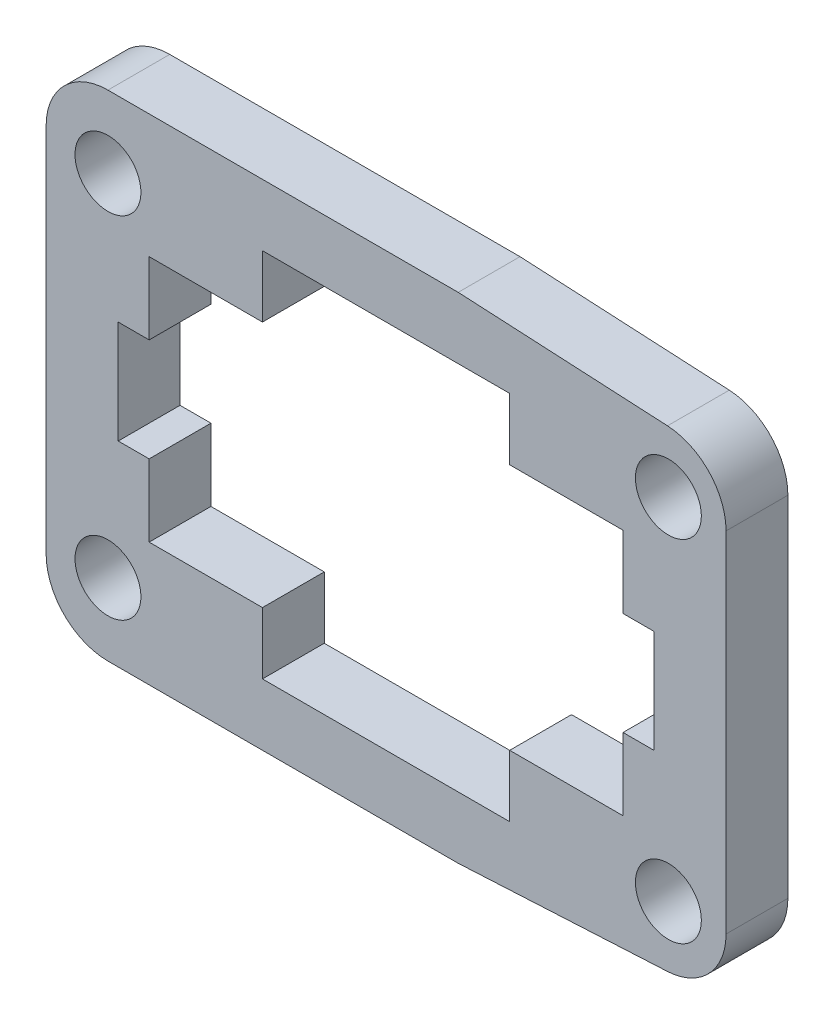
ISO-10303-21;
HEADER;
FILE_DESCRIPTION(('STEP AP214'),'2;1');
FILE_NAME('part.step','',(''),(''),'','','');
FILE_SCHEMA(('AUTOMOTIVE_DESIGN { 1 0 10303 214 1 1 1 1 }'));
ENDSEC;
DATA;
#1=APPLICATION_CONTEXT('core data for automotive mechanical design processes');
#2=APPLICATION_PROTOCOL_DEFINITION('international standard','automotive_design',2000,#1);
#3=PRODUCT_CONTEXT('',#1,'mechanical');
#4=PRODUCT('Part','Part','',(#3));
#5=PRODUCT_RELATED_PRODUCT_CATEGORY('part','',(#4));
#6=PRODUCT_DEFINITION_FORMATION('','',#4);
#7=PRODUCT_DEFINITION_CONTEXT('part definition',#1,'design');
#8=PRODUCT_DEFINITION('design','',#6,#7);
#9=PRODUCT_DEFINITION_SHAPE('','',#8);
#10=(LENGTH_UNIT() NAMED_UNIT(*) SI_UNIT(.MILLI.,.METRE.));
#11=(NAMED_UNIT(*) PLANE_ANGLE_UNIT() SI_UNIT($,.RADIAN.));
#12=(NAMED_UNIT(*) SI_UNIT($,.STERADIAN.) SOLID_ANGLE_UNIT());
#13=UNCERTAINTY_MEASURE_WITH_UNIT(LENGTH_MEASURE(1.E-05),#10,'distance_accuracy_value','');
#14=(GEOMETRIC_REPRESENTATION_CONTEXT(3) GLOBAL_UNCERTAINTY_ASSIGNED_CONTEXT((#13)) GLOBAL_UNIT_ASSIGNED_CONTEXT((#10,
#11,#12)) REPRESENTATION_CONTEXT('',''));
#15=CARTESIAN_POINT('',(0.,0.,0.));
#16=DIRECTION('',(0.,0.,1.));
#17=DIRECTION('',(1.,0.,0.));
#18=AXIS2_PLACEMENT_3D('',#15,#16,#17);
#19=CARTESIAN_POINT('',(24.0010920540107,23.4678047027526,0.));
#20=DIRECTION('',(0.0523034033778794,0.998631240245913,0.));
#21=DIRECTION('',(-0.998631240245913,0.0523034033778794,0.));
#22=AXIS2_PLACEMENT_3D('',#19,#20,#21);
#23=PLANE('',#22);
#24=DIRECTION('',(-0.998631240245913,0.0523034033778794,0.));
#25=VECTOR('',#24,1.);
#26=CARTESIAN_POINT('',(24.0010920540107,23.4678047027526,3.));
#27=LINE('',#26,#25);
#28=CARTESIAN_POINT('',(24.0010920540107,23.4678047027526,3.));
#29=VERTEX_POINT('',#28);
#30=CARTESIAN_POINT('',(13.8436818438771,23.9998,3.));
#31=VERTEX_POINT('',#30);
#32=EDGE_CURVE('E369',#29,#31,#27,.T.);
#33=ORIENTED_EDGE('',*,*,#32,.F.);
#34=DIRECTION('',(0.,0.,1.));
#35=VECTOR('',#34,1.);
#36=CARTESIAN_POINT('',(24.0010920540107,23.4678047027526,0.));
#37=LINE('',#36,#35);
#38=CARTESIAN_POINT('',(24.0010920540107,23.4678047027526,0.));
#39=VERTEX_POINT('',#38);
#40=EDGE_CURVE('E11',#39,#29,#37,.T.);
#41=ORIENTED_EDGE('',*,*,#40,.F.);
#42=DIRECTION('',(-0.998631240245913,0.0523034033778794,0.));
#43=VECTOR('',#42,1.);
#44=CARTESIAN_POINT('',(24.0010920540107,23.4678047027526,0.));
#45=LINE('',#44,#43);
#46=CARTESIAN_POINT('',(13.8436818438771,23.9998,0.));
#47=VERTEX_POINT('',#46);
#48=EDGE_CURVE('E405',#39,#47,#45,.T.);
#49=ORIENTED_EDGE('',*,*,#48,.T.);
#50=DIRECTION('',(0.,0.,1.));
#51=VECTOR('',#50,1.);
#52=CARTESIAN_POINT('',(13.8436818438771,23.9998,0.));
#53=LINE('',#52,#51);
#54=EDGE_CURVE('E42',#47,#31,#53,.T.);
#55=ORIENTED_EDGE('',*,*,#54,.T.);
#56=EDGE_LOOP('',(#33,#41,#49,#55));
#57=FACE_BOUND('',#56,.T.);
#58=ADVANCED_FACE('F39',(#57),#23,.T.);
#59=CARTESIAN_POINT('',(23.844181843877,20.4719109820149,0.));
#60=DIRECTION('',(0.,0.,1.));
#61=DIRECTION('',(1.,0.,0.));
#62=AXIS2_PLACEMENT_3D('',#59,#60,#61);
#63=CYLINDRICAL_SURFACE('',#62,2.99999999999996);
#64=CARTESIAN_POINT('',(23.844181843877,20.4719109820149,3.));
#65=DIRECTION('',(0.,0.,1.));
#66=DIRECTION('',(1.,0.,0.));
#67=AXIS2_PLACEMENT_3D('',#64,#65,#66);
#68=CIRCLE('',#67,2.99999999999996);
#69=CARTESIAN_POINT('',(26.844181843877,20.4719109820149,3.));
#70=VERTEX_POINT('',#69);
#71=EDGE_CURVE('E409',#70,#29,#68,.T.);
#72=ORIENTED_EDGE('',*,*,#71,.F.);
#73=DIRECTION('',(0.,0.,1.));
#74=VECTOR('',#73,1.);
#75=CARTESIAN_POINT('',(26.844181843877,20.4719109820149,0.));
#76=LINE('',#75,#74);
#77=CARTESIAN_POINT('',(26.844181843877,20.4719109820149,0.));
#78=VERTEX_POINT('',#77);
#79=EDGE_CURVE('E47',#78,#70,#76,.T.);
#80=ORIENTED_EDGE('',*,*,#79,.F.);
#81=CARTESIAN_POINT('',(23.844181843877,20.4719109820149,0.));
#82=DIRECTION('',(0.,0.,1.));
#83=DIRECTION('',(1.,0.,0.));
#84=AXIS2_PLACEMENT_3D('',#81,#82,#83);
#85=CIRCLE('',#84,2.99999999999996);
#86=EDGE_CURVE('E433',#78,#39,#85,.T.);
#87=ORIENTED_EDGE('',*,*,#86,.T.);
#88=ORIENTED_EDGE('',*,*,#40,.T.);
#89=EDGE_LOOP('',(#72,#80,#87,#88));
#90=FACE_BOUND('',#89,.T.);
#91=ADVANCED_FACE('F490',(#90),#63,.T.);
#92=CARTESIAN_POINT('',(26.844181843877,3.52888902362418,0.));
#93=DIRECTION('',(1.,0.,0.));
#94=DIRECTION('',(0.,1.,0.));
#95=AXIS2_PLACEMENT_3D('',#92,#93,#94);
#96=PLANE('',#95);
#97=DIRECTION('',(0.,1.,0.));
#98=VECTOR('',#97,1.);
#99=CARTESIAN_POINT('',(26.844181843877,3.52888902362418,3.));
#100=LINE('',#99,#98);
#101=CARTESIAN_POINT('',(26.844181843877,3.52888902362418,3.));
#102=VERTEX_POINT('',#101);
#103=EDGE_CURVE('E459',#102,#70,#100,.T.);
#104=ORIENTED_EDGE('',*,*,#103,.F.);
#105=DIRECTION('',(0.,0.,1.));
#106=VECTOR('',#105,1.);
#107=CARTESIAN_POINT('',(26.844181843877,3.52888902362418,0.));
#108=LINE('',#107,#106);
#109=CARTESIAN_POINT('',(26.844181843877,3.52888902362418,0.));
#110=VERTEX_POINT('',#109);
#111=EDGE_CURVE('E465',#110,#102,#108,.T.);
#112=ORIENTED_EDGE('',*,*,#111,.F.);
#113=DIRECTION('',(0.,1.,0.));
#114=VECTOR('',#113,1.);
#115=CARTESIAN_POINT('',(26.844181843877,3.52888902362418,0.));
#116=LINE('',#115,#114);
#117=EDGE_CURVE('E430',#110,#78,#116,.T.);
#118=ORIENTED_EDGE('',*,*,#117,.T.);
#119=ORIENTED_EDGE('',*,*,#79,.T.);
#120=EDGE_LOOP('',(#104,#112,#118,#119));
#121=FACE_BOUND('',#120,.T.);
#122=ADVANCED_FACE('F517',(#121),#96,.T.);
#123=CARTESIAN_POINT('',(23.844181843877,3.52888902362418,0.));
#124=DIRECTION('',(0.,0.,1.));
#125=DIRECTION('',(1.,0.,0.));
#126=AXIS2_PLACEMENT_3D('',#123,#124,#125);
#127=CYLINDRICAL_SURFACE('',#126,3.);
#128=CARTESIAN_POINT('',(23.844181843877,3.52888902362418,3.));
#129=DIRECTION('',(0.,0.,1.));
#130=DIRECTION('',(1.,0.,0.));
#131=AXIS2_PLACEMENT_3D('',#128,#129,#130);
#132=CIRCLE('',#131,3.);
#133=CARTESIAN_POINT('',(24.0013861888821,0.533010722706151,3.));
#134=VERTEX_POINT('',#133);
#135=EDGE_CURVE('E456',#134,#102,#132,.T.);
#136=ORIENTED_EDGE('',*,*,#135,.F.);
#137=DIRECTION('',(0.,0.,1.));
#138=VECTOR('',#137,1.);
#139=CARTESIAN_POINT('',(24.0013861888821,0.533010722706151,0.));
#140=LINE('',#139,#138);
#141=CARTESIAN_POINT('',(24.0013861888821,0.533010722706151,0.));
#142=VERTEX_POINT('',#141);
#143=EDGE_CURVE('E467',#142,#134,#140,.T.);
#144=ORIENTED_EDGE('',*,*,#143,.F.);
#145=CARTESIAN_POINT('',(23.844181843877,3.52888902362418,0.));
#146=DIRECTION('',(0.,0.,1.));
#147=DIRECTION('',(1.,0.,0.));
#148=AXIS2_PLACEMENT_3D('',#145,#146,#147);
#149=CIRCLE('',#148,3.);
#150=EDGE_CURVE('E427',#142,#110,#149,.T.);
#151=ORIENTED_EDGE('',*,*,#150,.T.);
#152=ORIENTED_EDGE('',*,*,#111,.T.);
#153=EDGE_LOOP('',(#136,#144,#151,#152));
#154=FACE_BOUND('',#153,.T.);
#155=ADVANCED_FACE('F515',(#154),#127,.T.);
#156=CARTESIAN_POINT('',(13.8436818438771,0.,0.));
#157=DIRECTION('',(0.0524014483350339,-0.998626100306011,0.));
#158=DIRECTION('',(0.998626100306011,0.0524014483350339,0.));
#159=AXIS2_PLACEMENT_3D('',#156,#157,#158);
#160=PLANE('',#159);
#161=DIRECTION('',(0.998626100306011,0.0524014483350339,0.));
#162=VECTOR('',#161,1.);
#163=CARTESIAN_POINT('',(13.8436818438771,0.,3.));
#164=LINE('',#163,#162);
#165=CARTESIAN_POINT('',(13.8436818438771,0.,3.));
#166=VERTEX_POINT('',#165);
#167=EDGE_CURVE('E453',#166,#134,#164,.T.);
#168=ORIENTED_EDGE('',*,*,#167,.F.);
#169=DIRECTION('',(0.,0.,1.));
#170=VECTOR('',#169,1.);
#171=CARTESIAN_POINT('',(13.8436818438771,0.,0.));
#172=LINE('',#171,#170);
#173=CARTESIAN_POINT('',(13.8436818438771,0.,0.));
#174=VERTEX_POINT('',#173);
#175=EDGE_CURVE('E469',#174,#166,#172,.T.);
#176=ORIENTED_EDGE('',*,*,#175,.F.);
#177=DIRECTION('',(0.998626100306011,0.0524014483350339,0.));
#178=VECTOR('',#177,1.);
#179=CARTESIAN_POINT('',(13.8436818438771,0.,0.));
#180=LINE('',#179,#178);
#181=EDGE_CURVE('E424',#174,#142,#180,.T.);
#182=ORIENTED_EDGE('',*,*,#181,.T.);
#183=ORIENTED_EDGE('',*,*,#143,.T.);
#184=EDGE_LOOP('',(#168,#176,#182,#183));
#185=FACE_BOUND('',#184,.T.);
#186=ADVANCED_FACE('F511',(#185),#160,.T.);
#187=CARTESIAN_POINT('',(-3.15711815612296,0.,0.));
#188=DIRECTION('',(0.,-1.,0.));
#189=DIRECTION('',(0.,0.,-1.));
#190=AXIS2_PLACEMENT_3D('',#187,#188,#189);
#191=PLANE('',#190);
#192=DIRECTION('',(1.,0.,0.));
#193=VECTOR('',#192,1.);
#194=CARTESIAN_POINT('',(-3.15711815612296,0.,3.));
#195=LINE('',#194,#193);
#196=CARTESIAN_POINT('',(-3.15711815612296,0.,3.));
#197=VERTEX_POINT('',#196);
#198=EDGE_CURVE('E450',#197,#166,#195,.T.);
#199=ORIENTED_EDGE('',*,*,#198,.F.);
#200=DIRECTION('',(0.,0.,1.));
#201=VECTOR('',#200,1.);
#202=CARTESIAN_POINT('',(-3.15711815612296,0.,0.));
#203=LINE('',#202,#201);
#204=CARTESIAN_POINT('',(-3.15711815612296,0.,0.));
#205=VERTEX_POINT('',#204);
#206=EDGE_CURVE('E471',#205,#197,#203,.T.);
#207=ORIENTED_EDGE('',*,*,#206,.F.);
#208=DIRECTION('',(1.,0.,0.));
#209=VECTOR('',#208,1.);
#210=CARTESIAN_POINT('',(-3.15711815612296,0.,0.));
#211=LINE('',#210,#209);
#212=EDGE_CURVE('E421',#205,#174,#211,.T.);
#213=ORIENTED_EDGE('',*,*,#212,.T.);
#214=ORIENTED_EDGE('',*,*,#175,.T.);
#215=EDGE_LOOP('',(#199,#207,#213,#214));
#216=FACE_BOUND('',#215,.T.);
#217=ADVANCED_FACE('F507',(#216),#191,.T.);
#218=CARTESIAN_POINT('',(-3.15711815612296,3.,0.));
#219=DIRECTION('',(0.,0.,1.));
#220=DIRECTION('',(1.,0.,0.));
#221=AXIS2_PLACEMENT_3D('',#218,#219,#220);
#222=CYLINDRICAL_SURFACE('',#221,3.);
#223=CARTESIAN_POINT('',(-3.15711815612296,3.,3.));
#224=DIRECTION('',(0.,0.,1.));
#225=DIRECTION('',(1.,0.,0.));
#226=AXIS2_PLACEMENT_3D('',#223,#224,#225);
#227=CIRCLE('',#226,3.);
#228=CARTESIAN_POINT('',(-6.15711815612296,3.,3.));
#229=VERTEX_POINT('',#228);
#230=EDGE_CURVE('E447',#229,#197,#227,.T.);
#231=ORIENTED_EDGE('',*,*,#230,.F.);
#232=DIRECTION('',(0.,0.,1.));
#233=VECTOR('',#232,1.);
#234=CARTESIAN_POINT('',(-6.15711815612296,3.,0.));
#235=LINE('',#234,#233);
#236=CARTESIAN_POINT('',(-6.15711815612296,3.,0.));
#237=VERTEX_POINT('',#236);
#238=EDGE_CURVE('E473',#237,#229,#235,.T.);
#239=ORIENTED_EDGE('',*,*,#238,.F.);
#240=CARTESIAN_POINT('',(-3.15711815612296,3.,0.));
#241=DIRECTION('',(0.,0.,1.));
#242=DIRECTION('',(1.,0.,0.));
#243=AXIS2_PLACEMENT_3D('',#240,#241,#242);
#244=CIRCLE('',#243,3.);
#245=EDGE_CURVE('E418',#237,#205,#244,.T.);
#246=ORIENTED_EDGE('',*,*,#245,.T.);
#247=ORIENTED_EDGE('',*,*,#206,.T.);
#248=EDGE_LOOP('',(#231,#239,#246,#247));
#249=FACE_BOUND('',#248,.T.);
#250=ADVANCED_FACE('F503',(#249),#222,.T.);
#251=CARTESIAN_POINT('',(-6.15711815612297,20.9998,0.));
#252=DIRECTION('',(-1.,0.,0.));
#253=DIRECTION('',(0.,-1.,0.));
#254=AXIS2_PLACEMENT_3D('',#251,#252,#253);
#255=PLANE('',#254);
#256=DIRECTION('',(0.,-1.,0.));
#257=VECTOR('',#256,1.);
#258=CARTESIAN_POINT('',(-6.15711815612297,20.9998,3.));
#259=LINE('',#258,#257);
#260=CARTESIAN_POINT('',(-6.15711815612296,20.9998,3.));
#261=VERTEX_POINT('',#260);
#262=EDGE_CURVE('E444',#261,#229,#259,.T.);
#263=ORIENTED_EDGE('',*,*,#262,.F.);
#264=DIRECTION('',(0.,0.,1.));
#265=VECTOR('',#264,1.);
#266=CARTESIAN_POINT('',(-6.15711815612296,20.9998,0.));
#267=LINE('',#266,#265);
#268=CARTESIAN_POINT('',(-6.15711815612296,20.9998,0.));
#269=VERTEX_POINT('',#268);
#270=EDGE_CURVE('E475',#269,#261,#267,.T.);
#271=ORIENTED_EDGE('',*,*,#270,.F.);
#272=DIRECTION('',(0.,-1.,0.));
#273=VECTOR('',#272,1.);
#274=CARTESIAN_POINT('',(-6.15711815612297,20.9998,0.));
#275=LINE('',#274,#273);
#276=EDGE_CURVE('E415',#269,#237,#275,.T.);
#277=ORIENTED_EDGE('',*,*,#276,.T.);
#278=ORIENTED_EDGE('',*,*,#238,.T.);
#279=EDGE_LOOP('',(#263,#271,#277,#278));
#280=FACE_BOUND('',#279,.T.);
#281=ADVANCED_FACE('F501',(#280),#255,.T.);
#282=CARTESIAN_POINT('',(-3.15711815612296,20.9998,0.));
#283=DIRECTION('',(0.,0.,1.));
#284=DIRECTION('',(1.,0.,0.));
#285=AXIS2_PLACEMENT_3D('',#282,#283,#284);
#286=CYLINDRICAL_SURFACE('',#285,3.);
#287=CARTESIAN_POINT('',(-3.15711815612296,20.9998,3.));
#288=DIRECTION('',(0.,0.,1.));
#289=DIRECTION('',(1.,0.,0.));
#290=AXIS2_PLACEMENT_3D('',#287,#288,#289);
#291=CIRCLE('',#290,3.);
#292=CARTESIAN_POINT('',(-3.15711815612296,23.9998,3.));
#293=VERTEX_POINT('',#292);
#294=EDGE_CURVE('E441',#293,#261,#291,.T.);
#295=ORIENTED_EDGE('',*,*,#294,.F.);
#296=DIRECTION('',(0.,0.,1.));
#297=VECTOR('',#296,1.);
#298=CARTESIAN_POINT('',(-3.15711815612296,23.9998,0.));
#299=LINE('',#298,#297);
#300=CARTESIAN_POINT('',(-3.15711815612296,23.9998,0.));
#301=VERTEX_POINT('',#300);
#302=EDGE_CURVE('E476',#301,#293,#299,.T.);
#303=ORIENTED_EDGE('',*,*,#302,.F.);
#304=CARTESIAN_POINT('',(-3.15711815612296,20.9998,0.));
#305=DIRECTION('',(0.,0.,1.));
#306=DIRECTION('',(1.,0.,0.));
#307=AXIS2_PLACEMENT_3D('',#304,#305,#306);
#308=CIRCLE('',#307,3.);
#309=EDGE_CURVE('E412',#301,#269,#308,.T.);
#310=ORIENTED_EDGE('',*,*,#309,.T.);
#311=ORIENTED_EDGE('',*,*,#270,.T.);
#312=EDGE_LOOP('',(#295,#303,#310,#311));
#313=FACE_BOUND('',#312,.T.);
#314=ADVANCED_FACE('F497',(#313),#286,.T.);
#315=CARTESIAN_POINT('',(13.8436818438771,23.9998,0.));
#316=DIRECTION('',(0.,1.,0.));
#317=DIRECTION('',(0.,0.,1.));
#318=AXIS2_PLACEMENT_3D('',#315,#316,#317);
#319=PLANE('',#318);
#320=DIRECTION('',(-1.,0.,0.));
#321=VECTOR('',#320,1.);
#322=CARTESIAN_POINT('',(13.8436818438771,23.9998,3.));
#323=LINE('',#322,#321);
#324=EDGE_CURVE('E438',#31,#293,#323,.T.);
#325=ORIENTED_EDGE('',*,*,#324,.F.);
#326=ORIENTED_EDGE('',*,*,#54,.F.);
#327=DIRECTION('',(-1.,0.,0.));
#328=VECTOR('',#327,1.);
#329=CARTESIAN_POINT('',(13.8436818438771,23.9998,0.));
#330=LINE('',#329,#328);
#331=EDGE_CURVE('E408',#47,#301,#330,.T.);
#332=ORIENTED_EDGE('',*,*,#331,.T.);
#333=ORIENTED_EDGE('',*,*,#302,.T.);
#334=EDGE_LOOP('',(#325,#326,#332,#333));
#335=FACE_BOUND('',#334,.T.);
#336=ADVANCED_FACE('F484',(#335),#319,.T.);
#337=CARTESIAN_POINT('',(-3.15711815612296,20.9998,0.));
#338=DIRECTION('',(0.,0.,1.));
#339=DIRECTION('',(1.,0.,0.));
#340=AXIS2_PLACEMENT_3D('',#337,#338,#339);
#341=PLANE('',#340);
#342=CARTESIAN_POINT('',(-3.15601815612294,3.50114834928544,0.));
#343=DIRECTION('',(0.,0.,1.));
#344=DIRECTION('',(1.,0.,0.));
#345=AXIS2_PLACEMENT_3D('',#342,#343,#344);
#346=CIRCLE('',#345,1.6);
#347=CARTESIAN_POINT('',(-1.55601815612294,3.50114834928544,0.));
#348=VERTEX_POINT('',#347);
#349=EDGE_CURVE('E924',#348,#348,#346,.T.);
#350=ORIENTED_EDGE('',*,*,#349,.T.);
#351=EDGE_LOOP('',(#350));
#352=FACE_BOUND('',#351,.T.);
#353=CARTESIAN_POINT('',(24.044031843877,3.50114834928544,0.));
#354=DIRECTION('',(0.,0.,1.));
#355=DIRECTION('',(1.,0.,0.));
#356=AXIS2_PLACEMENT_3D('',#353,#354,#355);
#357=CIRCLE('',#356,1.6);
#358=CARTESIAN_POINT('',(25.644031843877,3.50114834928544,0.));
#359=VERTEX_POINT('',#358);
#360=EDGE_CURVE('E945',#359,#359,#357,.T.);
#361=ORIENTED_EDGE('',*,*,#360,.T.);
#362=EDGE_LOOP('',(#361));
#363=FACE_BOUND('',#362,.T.);
#364=CARTESIAN_POINT('',(24.044031843877,20.4983516507146,0.));
#365=DIRECTION('',(0.,0.,1.));
#366=DIRECTION('',(1.,0.,0.));
#367=AXIS2_PLACEMENT_3D('',#364,#365,#366);
#368=CIRCLE('',#367,1.6);
#369=CARTESIAN_POINT('',(25.644031843877,20.4983516507146,0.));
#370=VERTEX_POINT('',#369);
#371=EDGE_CURVE('E936',#370,#370,#368,.T.);
#372=ORIENTED_EDGE('',*,*,#371,.T.);
#373=EDGE_LOOP('',(#372));
#374=FACE_BOUND('',#373,.T.);
#375=CARTESIAN_POINT('',(-3.15601815612294,20.4983516507146,0.));
#376=DIRECTION('',(0.,0.,1.));
#377=DIRECTION('',(1.,0.,0.));
#378=AXIS2_PLACEMENT_3D('',#375,#376,#377);
#379=CIRCLE('',#378,1.6);
#380=CARTESIAN_POINT('',(-1.55601815612294,20.4983516507146,0.));
#381=VERTEX_POINT('',#380);
#382=EDGE_CURVE('E315',#381,#381,#379,.T.);
#383=ORIENTED_EDGE('',*,*,#382,.T.);
#384=EDGE_LOOP('',(#383));
#385=FACE_BOUND('',#384,.T.);
#386=DIRECTION('',(-1.,0.,0.));
#387=VECTOR('',#386,1.);
#388=CARTESIAN_POINT('',(21.843181843877,14.4995,0.));
#389=LINE('',#388,#387);
#390=CARTESIAN_POINT('',(23.343481843877,14.4995,0.));
#391=VERTEX_POINT('',#390);
#392=CARTESIAN_POINT('',(21.843181843877,14.4995,0.));
#393=VERTEX_POINT('',#392);
#394=EDGE_CURVE('E244',#391,#393,#389,.T.);
#395=ORIENTED_EDGE('',*,*,#394,.T.);
#396=DIRECTION('',(0.,1.,0.));
#397=VECTOR('',#396,1.);
#398=CARTESIAN_POINT('',(21.843181843877,17.9998,0.));
#399=LINE('',#398,#397);
#400=CARTESIAN_POINT('',(21.843181843877,17.9998,0.));
#401=VERTEX_POINT('',#400);
#402=EDGE_CURVE('E238',#393,#401,#399,.T.);
#403=ORIENTED_EDGE('',*,*,#402,.T.);
#404=DIRECTION('',(-1.,0.,0.));
#405=VECTOR('',#404,1.);
#406=CARTESIAN_POINT('',(16.3433818438771,17.9998,0.));
#407=LINE('',#406,#405);
#408=CARTESIAN_POINT('',(16.3433818438771,17.9998,0.));
#409=VERTEX_POINT('',#408);
#410=EDGE_CURVE('E247',#401,#409,#407,.T.);
#411=ORIENTED_EDGE('',*,*,#410,.T.);
#412=DIRECTION('',(0.,1.,0.));
#413=VECTOR('',#412,1.);
#414=CARTESIAN_POINT('',(16.3433818438771,20.9998,0.));
#415=LINE('',#414,#413);
#416=CARTESIAN_POINT('',(16.3433818438771,20.9998,0.));
#417=VERTEX_POINT('',#416);
#418=EDGE_CURVE('E55',#409,#417,#415,.T.);
#419=ORIENTED_EDGE('',*,*,#418,.T.);
#420=DIRECTION('',(-1.,0.,0.));
#421=VECTOR('',#420,1.);
#422=CARTESIAN_POINT('',(4.34338184387702,20.9998,0.));
#423=LINE('',#422,#421);
#424=CARTESIAN_POINT('',(4.34338184387702,20.9998,0.));
#425=VERTEX_POINT('',#424);
#426=EDGE_CURVE('E265',#417,#425,#423,.T.);
#427=ORIENTED_EDGE('',*,*,#426,.T.);
#428=DIRECTION('',(0.,-1.,0.));
#429=VECTOR('',#428,1.);
#430=CARTESIAN_POINT('',(4.34338184387702,17.9998,0.));
#431=LINE('',#430,#429);
#432=CARTESIAN_POINT('',(4.34338184387702,17.9998,0.));
#433=VERTEX_POINT('',#432);
#434=EDGE_CURVE('E268',#425,#433,#431,.T.);
#435=ORIENTED_EDGE('',*,*,#434,.T.);
#436=DIRECTION('',(-1.,0.,0.));
#437=VECTOR('',#436,1.);
#438=CARTESIAN_POINT('',(-1.15651815612298,17.9998,0.));
#439=LINE('',#438,#437);
#440=CARTESIAN_POINT('',(-1.15651815612298,17.9998,0.));
#441=VERTEX_POINT('',#440);
#442=EDGE_CURVE('E271',#433,#441,#439,.T.);
#443=ORIENTED_EDGE('',*,*,#442,.T.);
#444=DIRECTION('',(0.,-1.,0.));
#445=VECTOR('',#444,1.);
#446=CARTESIAN_POINT('',(-1.15651815612297,14.4995,0.));
#447=LINE('',#446,#445);
#448=CARTESIAN_POINT('',(-1.15651815612297,14.4995,0.));
#449=VERTEX_POINT('',#448);
#450=EDGE_CURVE('E274',#441,#449,#447,.T.);
#451=ORIENTED_EDGE('',*,*,#450,.T.);
#452=DIRECTION('',(-1.,0.,0.));
#453=VECTOR('',#452,1.);
#454=CARTESIAN_POINT('',(-2.65681815612294,14.4995,0.));
#455=LINE('',#454,#453);
#456=CARTESIAN_POINT('',(-2.65681815612294,14.4995,0.));
#457=VERTEX_POINT('',#456);
#458=EDGE_CURVE('E277',#449,#457,#455,.T.);
#459=ORIENTED_EDGE('',*,*,#458,.T.);
#460=DIRECTION('',(0.,-1.,0.));
#461=VECTOR('',#460,1.);
#462=CARTESIAN_POINT('',(-2.65681815612294,9.5,0.));
#463=LINE('',#462,#461);
#464=CARTESIAN_POINT('',(-2.65681815612294,9.5,0.));
#465=VERTEX_POINT('',#464);
#466=EDGE_CURVE('E280',#457,#465,#463,.T.);
#467=ORIENTED_EDGE('',*,*,#466,.T.);
#468=DIRECTION('',(1.,0.,0.));
#469=VECTOR('',#468,1.);
#470=CARTESIAN_POINT('',(-1.15651815612297,9.5,0.));
#471=LINE('',#470,#469);
#472=CARTESIAN_POINT('',(-1.15651815612297,9.5,0.));
#473=VERTEX_POINT('',#472);
#474=EDGE_CURVE('E283',#465,#473,#471,.T.);
#475=ORIENTED_EDGE('',*,*,#474,.T.);
#476=DIRECTION('',(0.,-1.,0.));
#477=VECTOR('',#476,1.);
#478=CARTESIAN_POINT('',(-1.15651815612298,6.,0.));
#479=LINE('',#478,#477);
#480=CARTESIAN_POINT('',(-1.15651815612298,6.,0.));
#481=VERTEX_POINT('',#480);
#482=EDGE_CURVE('E286',#473,#481,#479,.T.);
#483=ORIENTED_EDGE('',*,*,#482,.T.);
#484=DIRECTION('',(1.,0.,0.));
#485=VECTOR('',#484,1.);
#486=CARTESIAN_POINT('',(4.34338184387701,6.,0.));
#487=LINE('',#486,#485);
#488=CARTESIAN_POINT('',(4.34338184387701,6.,0.));
#489=VERTEX_POINT('',#488);
#490=EDGE_CURVE('E289',#481,#489,#487,.T.);
#491=ORIENTED_EDGE('',*,*,#490,.T.);
#492=DIRECTION('',(0.,-1.,0.));
#493=VECTOR('',#492,1.);
#494=CARTESIAN_POINT('',(4.34338184387701,3.,0.));
#495=LINE('',#494,#493);
#496=CARTESIAN_POINT('',(4.34338184387701,3.,0.));
#497=VERTEX_POINT('',#496);
#498=EDGE_CURVE('E292',#489,#497,#495,.T.);
#499=ORIENTED_EDGE('',*,*,#498,.T.);
#500=DIRECTION('',(1.,0.,0.));
#501=VECTOR('',#500,1.);
#502=CARTESIAN_POINT('',(16.3433818438771,3.,0.));
#503=LINE('',#502,#501);
#504=CARTESIAN_POINT('',(16.3433818438771,3.,0.));
#505=VERTEX_POINT('',#504);
#506=EDGE_CURVE('E295',#497,#505,#503,.T.);
#507=ORIENTED_EDGE('',*,*,#506,.T.);
#508=DIRECTION('',(0.,1.,0.));
#509=VECTOR('',#508,1.);
#510=CARTESIAN_POINT('',(16.3433818438771,6.,0.));
#511=LINE('',#510,#509);
#512=CARTESIAN_POINT('',(16.3433818438771,6.,0.));
#513=VERTEX_POINT('',#512);
#514=EDGE_CURVE('E298',#505,#513,#511,.T.);
#515=ORIENTED_EDGE('',*,*,#514,.T.);
#516=DIRECTION('',(1.,0.,0.));
#517=VECTOR('',#516,1.);
#518=CARTESIAN_POINT('',(21.843181843877,6.,0.));
#519=LINE('',#518,#517);
#520=CARTESIAN_POINT('',(21.843181843877,6.,0.));
#521=VERTEX_POINT('',#520);
#522=EDGE_CURVE('E301',#513,#521,#519,.T.);
#523=ORIENTED_EDGE('',*,*,#522,.T.);
#524=DIRECTION('',(0.,1.,0.));
#525=VECTOR('',#524,1.);
#526=CARTESIAN_POINT('',(21.843181843877,9.5,0.));
#527=LINE('',#526,#525);
#528=CARTESIAN_POINT('',(21.843181843877,9.5,0.));
#529=VERTEX_POINT('',#528);
#530=EDGE_CURVE('E304',#521,#529,#527,.T.);
#531=ORIENTED_EDGE('',*,*,#530,.T.);
#532=DIRECTION('',(1.,0.,0.));
#533=VECTOR('',#532,1.);
#534=CARTESIAN_POINT('',(23.343481843877,9.5,0.));
#535=LINE('',#534,#533);
#536=CARTESIAN_POINT('',(23.343481843877,9.5,0.));
#537=VERTEX_POINT('',#536);
#538=EDGE_CURVE('E307',#529,#537,#535,.T.);
#539=ORIENTED_EDGE('',*,*,#538,.T.);
#540=DIRECTION('',(0.,1.,0.));
#541=VECTOR('',#540,1.);
#542=CARTESIAN_POINT('',(23.343481843877,14.4995,0.));
#543=LINE('',#542,#541);
#544=EDGE_CURVE('E310',#537,#391,#543,.T.);
#545=ORIENTED_EDGE('',*,*,#544,.T.);
#546=EDGE_LOOP('',(#395,#403,#411,#419,#427,#435,#443,#451,#459,#467,#475,#483,#491,#499,#507,
#515,#523,#531,#539,#545));
#547=FACE_BOUND('',#546,.T.);
#548=ORIENTED_EDGE('',*,*,#48,.F.);
#549=ORIENTED_EDGE('',*,*,#86,.F.);
#550=ORIENTED_EDGE('',*,*,#117,.F.);
#551=ORIENTED_EDGE('',*,*,#150,.F.);
#552=ORIENTED_EDGE('',*,*,#181,.F.);
#553=ORIENTED_EDGE('',*,*,#212,.F.);
#554=ORIENTED_EDGE('',*,*,#245,.F.);
#555=ORIENTED_EDGE('',*,*,#276,.F.);
#556=ORIENTED_EDGE('',*,*,#309,.F.);
#557=ORIENTED_EDGE('',*,*,#331,.F.);
#558=EDGE_LOOP('',(#548,#549,#550,#551,#552,#553,#554,#555,#556,#557));
#559=FACE_BOUND('',#558,.T.);
#560=ADVANCED_FACE('F251',(#352,#363,#374,#385,#547,#559),#341,.F.);
#561=CARTESIAN_POINT('',(-3.15711815612296,20.9998,3.));
#562=DIRECTION('',(0.,0.,1.));
#563=DIRECTION('',(1.,0.,0.));
#564=AXIS2_PLACEMENT_3D('',#561,#562,#563);
#565=PLANE('',#564);
#566=CARTESIAN_POINT('',(-3.15601815612294,3.50114834928544,3.));
#567=DIRECTION('',(0.,0.,1.));
#568=DIRECTION('',(1.,0.,0.));
#569=AXIS2_PLACEMENT_3D('',#566,#567,#568);
#570=CIRCLE('',#569,1.6);
#571=CARTESIAN_POINT('',(-1.55601815612294,3.50114834928544,3.));
#572=VERTEX_POINT('',#571);
#573=EDGE_CURVE('E927',#572,#572,#570,.T.);
#574=ORIENTED_EDGE('',*,*,#573,.F.);
#575=EDGE_LOOP('',(#574));
#576=FACE_BOUND('',#575,.T.);
#577=CARTESIAN_POINT('',(24.044031843877,3.50114834928544,3.));
#578=DIRECTION('',(0.,0.,1.));
#579=DIRECTION('',(1.,0.,0.));
#580=AXIS2_PLACEMENT_3D('',#577,#578,#579);
#581=CIRCLE('',#580,1.6);
#582=CARTESIAN_POINT('',(25.644031843877,3.50114834928544,3.));
#583=VERTEX_POINT('',#582);
#584=EDGE_CURVE('E929',#583,#583,#581,.T.);
#585=ORIENTED_EDGE('',*,*,#584,.F.);
#586=EDGE_LOOP('',(#585));
#587=FACE_BOUND('',#586,.T.);
#588=CARTESIAN_POINT('',(24.044031843877,20.4983516507146,3.));
#589=DIRECTION('',(0.,0.,1.));
#590=DIRECTION('',(1.,0.,0.));
#591=AXIS2_PLACEMENT_3D('',#588,#589,#590);
#592=CIRCLE('',#591,1.6);
#593=CARTESIAN_POINT('',(25.644031843877,20.4983516507146,3.));
#594=VERTEX_POINT('',#593);
#595=EDGE_CURVE('E940',#594,#594,#592,.T.);
#596=ORIENTED_EDGE('',*,*,#595,.F.);
#597=EDGE_LOOP('',(#596));
#598=FACE_BOUND('',#597,.T.);
#599=CARTESIAN_POINT('',(-3.15601815612294,20.4983516507146,3.));
#600=DIRECTION('',(0.,0.,1.));
#601=DIRECTION('',(1.,0.,0.));
#602=AXIS2_PLACEMENT_3D('',#599,#600,#601);
#603=CIRCLE('',#602,1.6);
#604=CARTESIAN_POINT('',(-1.55601815612294,20.4983516507146,3.));
#605=VERTEX_POINT('',#604);
#606=EDGE_CURVE('E261',#605,#605,#603,.T.);
#607=ORIENTED_EDGE('',*,*,#606,.F.);
#608=EDGE_LOOP('',(#607));
#609=FACE_BOUND('',#608,.T.);
#610=DIRECTION('',(0.,1.,0.));
#611=VECTOR('',#610,1.);
#612=CARTESIAN_POINT('',(21.843181843877,17.9998,3.));
#613=LINE('',#612,#611);
#614=CARTESIAN_POINT('',(21.843181843877,14.4995,3.));
#615=VERTEX_POINT('',#614);
#616=CARTESIAN_POINT('',(21.843181843877,17.9998,3.));
#617=VERTEX_POINT('',#616);
#618=EDGE_CURVE('E63',#615,#617,#613,.T.);
#619=ORIENTED_EDGE('',*,*,#618,.F.);
#620=DIRECTION('',(-1.,0.,0.));
#621=VECTOR('',#620,1.);
#622=CARTESIAN_POINT('',(21.843181843877,14.4995,3.));
#623=LINE('',#622,#621);
#624=CARTESIAN_POINT('',(23.343481843877,14.4995,3.));
#625=VERTEX_POINT('',#624);
#626=EDGE_CURVE('E255',#625,#615,#623,.T.);
#627=ORIENTED_EDGE('',*,*,#626,.F.);
#628=DIRECTION('',(0.,1.,0.));
#629=VECTOR('',#628,1.);
#630=CARTESIAN_POINT('',(23.343481843877,14.4995,3.));
#631=LINE('',#630,#629);
#632=CARTESIAN_POINT('',(23.343481843877,9.5,3.));
#633=VERTEX_POINT('',#632);
#634=EDGE_CURVE('E258',#633,#625,#631,.T.);
#635=ORIENTED_EDGE('',*,*,#634,.F.);
#636=DIRECTION('',(1.,0.,0.));
#637=VECTOR('',#636,1.);
#638=CARTESIAN_POINT('',(23.343481843877,9.5,3.));
#639=LINE('',#638,#637);
#640=CARTESIAN_POINT('',(21.843181843877,9.5,3.));
#641=VERTEX_POINT('',#640);
#642=EDGE_CURVE('E362',#641,#633,#639,.T.);
#643=ORIENTED_EDGE('',*,*,#642,.F.);
#644=DIRECTION('',(0.,1.,0.));
#645=VECTOR('',#644,1.);
#646=CARTESIAN_POINT('',(21.843181843877,9.5,3.));
#647=LINE('',#646,#645);
#648=CARTESIAN_POINT('',(21.843181843877,6.,3.));
#649=VERTEX_POINT('',#648);
#650=EDGE_CURVE('E359',#649,#641,#647,.T.);
#651=ORIENTED_EDGE('',*,*,#650,.F.);
#652=DIRECTION('',(1.,0.,0.));
#653=VECTOR('',#652,1.);
#654=CARTESIAN_POINT('',(21.843181843877,6.,3.));
#655=LINE('',#654,#653);
#656=CARTESIAN_POINT('',(16.3433818438771,6.,3.));
#657=VERTEX_POINT('',#656);
#658=EDGE_CURVE('E356',#657,#649,#655,.T.);
#659=ORIENTED_EDGE('',*,*,#658,.F.);
#660=DIRECTION('',(0.,1.,0.));
#661=VECTOR('',#660,1.);
#662=CARTESIAN_POINT('',(16.3433818438771,6.,3.));
#663=LINE('',#662,#661);
#664=CARTESIAN_POINT('',(16.3433818438771,3.,3.));
#665=VERTEX_POINT('',#664);
#666=EDGE_CURVE('E353',#665,#657,#663,.T.);
#667=ORIENTED_EDGE('',*,*,#666,.F.);
#668=DIRECTION('',(1.,0.,0.));
#669=VECTOR('',#668,1.);
#670=CARTESIAN_POINT('',(16.3433818438771,3.,3.));
#671=LINE('',#670,#669);
#672=CARTESIAN_POINT('',(4.34338184387701,3.,3.));
#673=VERTEX_POINT('',#672);
#674=EDGE_CURVE('E350',#673,#665,#671,.T.);
#675=ORIENTED_EDGE('',*,*,#674,.F.);
#676=DIRECTION('',(0.,-1.,0.));
#677=VECTOR('',#676,1.);
#678=CARTESIAN_POINT('',(4.34338184387701,3.,3.));
#679=LINE('',#678,#677);
#680=CARTESIAN_POINT('',(4.34338184387701,6.,3.));
#681=VERTEX_POINT('',#680);
#682=EDGE_CURVE('E347',#681,#673,#679,.T.);
#683=ORIENTED_EDGE('',*,*,#682,.F.);
#684=DIRECTION('',(1.,0.,0.));
#685=VECTOR('',#684,1.);
#686=CARTESIAN_POINT('',(4.34338184387701,6.,3.));
#687=LINE('',#686,#685);
#688=CARTESIAN_POINT('',(-1.15651815612298,6.,3.));
#689=VERTEX_POINT('',#688);
#690=EDGE_CURVE('E344',#689,#681,#687,.T.);
#691=ORIENTED_EDGE('',*,*,#690,.F.);
#692=DIRECTION('',(0.,-1.,0.));
#693=VECTOR('',#692,1.);
#694=CARTESIAN_POINT('',(-1.15651815612298,6.,3.));
#695=LINE('',#694,#693);
#696=CARTESIAN_POINT('',(-1.15651815612297,9.5,3.));
#697=VERTEX_POINT('',#696);
#698=EDGE_CURVE('E341',#697,#689,#695,.T.);
#699=ORIENTED_EDGE('',*,*,#698,.F.);
#700=DIRECTION('',(1.,0.,0.));
#701=VECTOR('',#700,1.);
#702=CARTESIAN_POINT('',(-1.15651815612297,9.5,3.));
#703=LINE('',#702,#701);
#704=CARTESIAN_POINT('',(-2.65681815612294,9.5,3.));
#705=VERTEX_POINT('',#704);
#706=EDGE_CURVE('E338',#705,#697,#703,.T.);
#707=ORIENTED_EDGE('',*,*,#706,.F.);
#708=DIRECTION('',(0.,-1.,0.));
#709=VECTOR('',#708,1.);
#710=CARTESIAN_POINT('',(-2.65681815612294,9.5,3.));
#711=LINE('',#710,#709);
#712=CARTESIAN_POINT('',(-2.65681815612294,14.4995,3.));
#713=VERTEX_POINT('',#712);
#714=EDGE_CURVE('E335',#713,#705,#711,.T.);
#715=ORIENTED_EDGE('',*,*,#714,.F.);
#716=DIRECTION('',(-1.,0.,0.));
#717=VECTOR('',#716,1.);
#718=CARTESIAN_POINT('',(-2.65681815612294,14.4995,3.));
#719=LINE('',#718,#717);
#720=CARTESIAN_POINT('',(-1.15651815612297,14.4995,3.));
#721=VERTEX_POINT('',#720);
#722=EDGE_CURVE('E332',#721,#713,#719,.T.);
#723=ORIENTED_EDGE('',*,*,#722,.F.);
#724=DIRECTION('',(0.,-1.,0.));
#725=VECTOR('',#724,1.);
#726=CARTESIAN_POINT('',(-1.15651815612297,14.4995,3.));
#727=LINE('',#726,#725);
#728=CARTESIAN_POINT('',(-1.15651815612298,17.9998,3.));
#729=VERTEX_POINT('',#728);
#730=EDGE_CURVE('E329',#729,#721,#727,.T.);
#731=ORIENTED_EDGE('',*,*,#730,.F.);
#732=DIRECTION('',(-1.,0.,0.));
#733=VECTOR('',#732,1.);
#734=CARTESIAN_POINT('',(-1.15651815612298,17.9998,3.));
#735=LINE('',#734,#733);
#736=CARTESIAN_POINT('',(4.34338184387702,17.9998,3.));
#737=VERTEX_POINT('',#736);
#738=EDGE_CURVE('E326',#737,#729,#735,.T.);
#739=ORIENTED_EDGE('',*,*,#738,.F.);
#740=DIRECTION('',(0.,-1.,0.));
#741=VECTOR('',#740,1.);
#742=CARTESIAN_POINT('',(4.34338184387702,17.9998,3.));
#743=LINE('',#742,#741);
#744=CARTESIAN_POINT('',(4.34338184387702,20.9998,3.));
#745=VERTEX_POINT('',#744);
#746=EDGE_CURVE('E323',#745,#737,#743,.T.);
#747=ORIENTED_EDGE('',*,*,#746,.F.);
#748=DIRECTION('',(-1.,0.,0.));
#749=VECTOR('',#748,1.);
#750=CARTESIAN_POINT('',(4.34338184387702,20.9998,3.));
#751=LINE('',#750,#749);
#752=CARTESIAN_POINT('',(16.3433818438771,20.9998,3.));
#753=VERTEX_POINT('',#752);
#754=EDGE_CURVE('E320',#753,#745,#751,.T.);
#755=ORIENTED_EDGE('',*,*,#754,.F.);
#756=DIRECTION('',(0.,1.,0.));
#757=VECTOR('',#756,1.);
#758=CARTESIAN_POINT('',(16.3433818438771,20.9998,3.));
#759=LINE('',#758,#757);
#760=CARTESIAN_POINT('',(16.3433818438771,17.9998,3.));
#761=VERTEX_POINT('',#760);
#762=EDGE_CURVE('E317',#761,#753,#759,.T.);
#763=ORIENTED_EDGE('',*,*,#762,.F.);
#764=DIRECTION('',(-1.,0.,0.));
#765=VECTOR('',#764,1.);
#766=CARTESIAN_POINT('',(16.3433818438771,17.9998,3.));
#767=LINE('',#766,#765);
#768=EDGE_CURVE('E314',#617,#761,#767,.T.);
#769=ORIENTED_EDGE('',*,*,#768,.F.);
#770=EDGE_LOOP('',(#619,#627,#635,#643,#651,#659,#667,#675,#683,#691,#699,#707,#715,#723,#731,
#739,#747,#755,#763,#769));
#771=FACE_BOUND('',#770,.T.);
#772=ORIENTED_EDGE('',*,*,#32,.T.);
#773=ORIENTED_EDGE('',*,*,#324,.T.);
#774=ORIENTED_EDGE('',*,*,#294,.T.);
#775=ORIENTED_EDGE('',*,*,#262,.T.);
#776=ORIENTED_EDGE('',*,*,#230,.T.);
#777=ORIENTED_EDGE('',*,*,#198,.T.);
#778=ORIENTED_EDGE('',*,*,#167,.T.);
#779=ORIENTED_EDGE('',*,*,#135,.T.);
#780=ORIENTED_EDGE('',*,*,#103,.T.);
#781=ORIENTED_EDGE('',*,*,#71,.T.);
#782=EDGE_LOOP('',(#772,#773,#774,#775,#776,#777,#778,#779,#780,#781));
#783=FACE_BOUND('',#782,.T.);
#784=ADVANCED_FACE('F486',(#576,#587,#598,#609,#771,#783),#565,.T.);
#785=CARTESIAN_POINT('',(21.843181843877,17.9998,0.));
#786=DIRECTION('',(1.,0.,0.));
#787=DIRECTION('',(0.,0.,-1.));
#788=AXIS2_PLACEMENT_3D('',#785,#786,#787);
#789=PLANE('',#788);
#790=ORIENTED_EDGE('',*,*,#618,.T.);
#791=DIRECTION('',(0.,0.,1.));
#792=VECTOR('',#791,1.);
#793=CARTESIAN_POINT('',(21.843181843877,17.9998,0.));
#794=LINE('',#793,#792);
#795=EDGE_CURVE('E234',#401,#617,#794,.T.);
#796=ORIENTED_EDGE('',*,*,#795,.F.);
#797=ORIENTED_EDGE('',*,*,#402,.F.);
#798=DIRECTION('',(0.,0.,1.));
#799=VECTOR('',#798,1.);
#800=CARTESIAN_POINT('',(21.843181843877,14.4995,0.));
#801=LINE('',#800,#799);
#802=EDGE_CURVE('E367',#393,#615,#801,.T.);
#803=ORIENTED_EDGE('',*,*,#802,.T.);
#804=EDGE_LOOP('',(#790,#796,#797,#803));
#805=FACE_BOUND('',#804,.T.);
#806=ADVANCED_FACE('F236',(#805),#789,.F.);
#807=CARTESIAN_POINT('',(21.843181843877,14.4995,0.));
#808=DIRECTION('',(0.,1.,0.));
#809=DIRECTION('',(0.,0.,1.));
#810=AXIS2_PLACEMENT_3D('',#807,#808,#809);
#811=PLANE('',#810);
#812=ORIENTED_EDGE('',*,*,#626,.T.);
#813=ORIENTED_EDGE('',*,*,#802,.F.);
#814=ORIENTED_EDGE('',*,*,#394,.F.);
#815=DIRECTION('',(0.,0.,1.));
#816=VECTOR('',#815,1.);
#817=CARTESIAN_POINT('',(23.343481843877,14.4995,0.));
#818=LINE('',#817,#816);
#819=EDGE_CURVE('E370',#391,#625,#818,.T.);
#820=ORIENTED_EDGE('',*,*,#819,.T.);
#821=EDGE_LOOP('',(#812,#813,#814,#820));
#822=FACE_BOUND('',#821,.T.);
#823=ADVANCED_FACE('F610',(#822),#811,.F.);
#824=CARTESIAN_POINT('',(23.343481843877,14.4995,0.));
#825=DIRECTION('',(1.,0.,0.));
#826=DIRECTION('',(0.,0.,-1.));
#827=AXIS2_PLACEMENT_3D('',#824,#825,#826);
#828=PLANE('',#827);
#829=ORIENTED_EDGE('',*,*,#634,.T.);
#830=ORIENTED_EDGE('',*,*,#819,.F.);
#831=ORIENTED_EDGE('',*,*,#544,.F.);
#832=DIRECTION('',(0.,0.,1.));
#833=VECTOR('',#832,1.);
#834=CARTESIAN_POINT('',(23.343481843877,9.5,0.));
#835=LINE('',#834,#833);
#836=EDGE_CURVE('E372',#537,#633,#835,.T.);
#837=ORIENTED_EDGE('',*,*,#836,.T.);
#838=EDGE_LOOP('',(#829,#830,#831,#837));
#839=FACE_BOUND('',#838,.T.);
#840=ADVANCED_FACE('F622',(#839),#828,.F.);
#841=CARTESIAN_POINT('',(23.343481843877,9.5,0.));
#842=DIRECTION('',(0.,-1.,0.));
#843=DIRECTION('',(0.,0.,-1.));
#844=AXIS2_PLACEMENT_3D('',#841,#842,#843);
#845=PLANE('',#844);
#846=ORIENTED_EDGE('',*,*,#642,.T.);
#847=ORIENTED_EDGE('',*,*,#836,.F.);
#848=ORIENTED_EDGE('',*,*,#538,.F.);
#849=DIRECTION('',(0.,0.,1.));
#850=VECTOR('',#849,1.);
#851=CARTESIAN_POINT('',(21.843181843877,9.5,0.));
#852=LINE('',#851,#850);
#853=EDGE_CURVE('E374',#529,#641,#852,.T.);
#854=ORIENTED_EDGE('',*,*,#853,.T.);
#855=EDGE_LOOP('',(#846,#847,#848,#854));
#856=FACE_BOUND('',#855,.T.);
#857=ADVANCED_FACE('F633',(#856),#845,.F.);
#858=CARTESIAN_POINT('',(21.843181843877,9.5,0.));
#859=DIRECTION('',(1.,0.,0.));
#860=DIRECTION('',(0.,0.,-1.));
#861=AXIS2_PLACEMENT_3D('',#858,#859,#860);
#862=PLANE('',#861);
#863=ORIENTED_EDGE('',*,*,#650,.T.);
#864=ORIENTED_EDGE('',*,*,#853,.F.);
#865=ORIENTED_EDGE('',*,*,#530,.F.);
#866=DIRECTION('',(0.,0.,1.));
#867=VECTOR('',#866,1.);
#868=CARTESIAN_POINT('',(21.843181843877,6.,0.));
#869=LINE('',#868,#867);
#870=EDGE_CURVE('E376',#521,#649,#869,.T.);
#871=ORIENTED_EDGE('',*,*,#870,.T.);
#872=EDGE_LOOP('',(#863,#864,#865,#871));
#873=FACE_BOUND('',#872,.T.);
#874=ADVANCED_FACE('F644',(#873),#862,.F.);
#875=CARTESIAN_POINT('',(21.843181843877,6.,0.));
#876=DIRECTION('',(0.,-1.,0.));
#877=DIRECTION('',(0.,0.,-1.));
#878=AXIS2_PLACEMENT_3D('',#875,#876,#877);
#879=PLANE('',#878);
#880=ORIENTED_EDGE('',*,*,#658,.T.);
#881=ORIENTED_EDGE('',*,*,#870,.F.);
#882=ORIENTED_EDGE('',*,*,#522,.F.);
#883=DIRECTION('',(0.,0.,1.));
#884=VECTOR('',#883,1.);
#885=CARTESIAN_POINT('',(16.3433818438771,6.,0.));
#886=LINE('',#885,#884);
#887=EDGE_CURVE('E378',#513,#657,#886,.T.);
#888=ORIENTED_EDGE('',*,*,#887,.T.);
#889=EDGE_LOOP('',(#880,#881,#882,#888));
#890=FACE_BOUND('',#889,.T.);
#891=ADVANCED_FACE('F655',(#890),#879,.F.);
#892=CARTESIAN_POINT('',(16.3433818438771,6.,0.));
#893=DIRECTION('',(1.,0.,0.));
#894=DIRECTION('',(0.,0.,-1.));
#895=AXIS2_PLACEMENT_3D('',#892,#893,#894);
#896=PLANE('',#895);
#897=ORIENTED_EDGE('',*,*,#666,.T.);
#898=ORIENTED_EDGE('',*,*,#887,.F.);
#899=ORIENTED_EDGE('',*,*,#514,.F.);
#900=DIRECTION('',(0.,0.,1.));
#901=VECTOR('',#900,1.);
#902=CARTESIAN_POINT('',(16.3433818438771,3.,0.));
#903=LINE('',#902,#901);
#904=EDGE_CURVE('E380',#505,#665,#903,.T.);
#905=ORIENTED_EDGE('',*,*,#904,.T.);
#906=EDGE_LOOP('',(#897,#898,#899,#905));
#907=FACE_BOUND('',#906,.T.);
#908=ADVANCED_FACE('F666',(#907),#896,.F.);
#909=CARTESIAN_POINT('',(16.3433818438771,3.,0.));
#910=DIRECTION('',(0.,-1.,0.));
#911=DIRECTION('',(0.,0.,-1.));
#912=AXIS2_PLACEMENT_3D('',#909,#910,#911);
#913=PLANE('',#912);
#914=ORIENTED_EDGE('',*,*,#674,.T.);
#915=ORIENTED_EDGE('',*,*,#904,.F.);
#916=ORIENTED_EDGE('',*,*,#506,.F.);
#917=DIRECTION('',(0.,0.,1.));
#918=VECTOR('',#917,1.);
#919=CARTESIAN_POINT('',(4.34338184387701,3.,0.));
#920=LINE('',#919,#918);
#921=EDGE_CURVE('E382',#497,#673,#920,.T.);
#922=ORIENTED_EDGE('',*,*,#921,.T.);
#923=EDGE_LOOP('',(#914,#915,#916,#922));
#924=FACE_BOUND('',#923,.T.);
#925=ADVANCED_FACE('F677',(#924),#913,.F.);
#926=CARTESIAN_POINT('',(4.34338184387701,3.,0.));
#927=DIRECTION('',(-1.,0.,0.));
#928=DIRECTION('',(0.,0.,1.));
#929=AXIS2_PLACEMENT_3D('',#926,#927,#928);
#930=PLANE('',#929);
#931=ORIENTED_EDGE('',*,*,#682,.T.);
#932=ORIENTED_EDGE('',*,*,#921,.F.);
#933=ORIENTED_EDGE('',*,*,#498,.F.);
#934=DIRECTION('',(0.,0.,1.));
#935=VECTOR('',#934,1.);
#936=CARTESIAN_POINT('',(4.34338184387701,6.,0.));
#937=LINE('',#936,#935);
#938=EDGE_CURVE('E384',#489,#681,#937,.T.);
#939=ORIENTED_EDGE('',*,*,#938,.T.);
#940=EDGE_LOOP('',(#931,#932,#933,#939));
#941=FACE_BOUND('',#940,.T.);
#942=ADVANCED_FACE('F688',(#941),#930,.F.);
#943=CARTESIAN_POINT('',(4.34338184387701,6.,0.));
#944=DIRECTION('',(0.,-1.,0.));
#945=DIRECTION('',(0.,0.,-1.));
#946=AXIS2_PLACEMENT_3D('',#943,#944,#945);
#947=PLANE('',#946);
#948=ORIENTED_EDGE('',*,*,#690,.T.);
#949=ORIENTED_EDGE('',*,*,#938,.F.);
#950=ORIENTED_EDGE('',*,*,#490,.F.);
#951=DIRECTION('',(0.,0.,1.));
#952=VECTOR('',#951,1.);
#953=CARTESIAN_POINT('',(-1.15651815612298,6.,0.));
#954=LINE('',#953,#952);
#955=EDGE_CURVE('E386',#481,#689,#954,.T.);
#956=ORIENTED_EDGE('',*,*,#955,.T.);
#957=EDGE_LOOP('',(#948,#949,#950,#956));
#958=FACE_BOUND('',#957,.T.);
#959=ADVANCED_FACE('F699',(#958),#947,.F.);
#960=CARTESIAN_POINT('',(-1.15651815612298,6.,0.));
#961=DIRECTION('',(-1.,0.,0.));
#962=DIRECTION('',(0.,-1.,0.));
#963=AXIS2_PLACEMENT_3D('',#960,#961,#962);
#964=PLANE('',#963);
#965=ORIENTED_EDGE('',*,*,#698,.T.);
#966=ORIENTED_EDGE('',*,*,#955,.F.);
#967=ORIENTED_EDGE('',*,*,#482,.F.);
#968=DIRECTION('',(0.,0.,1.));
#969=VECTOR('',#968,1.);
#970=CARTESIAN_POINT('',(-1.15651815612297,9.5,0.));
#971=LINE('',#970,#969);
#972=EDGE_CURVE('E388',#473,#697,#971,.T.);
#973=ORIENTED_EDGE('',*,*,#972,.T.);
#974=EDGE_LOOP('',(#965,#966,#967,#973));
#975=FACE_BOUND('',#974,.T.);
#976=ADVANCED_FACE('F710',(#975),#964,.F.);
#977=CARTESIAN_POINT('',(-1.15651815612297,9.5,0.));
#978=DIRECTION('',(0.,-1.,0.));
#979=DIRECTION('',(0.,0.,-1.));
#980=AXIS2_PLACEMENT_3D('',#977,#978,#979);
#981=PLANE('',#980);
#982=ORIENTED_EDGE('',*,*,#706,.T.);
#983=ORIENTED_EDGE('',*,*,#972,.F.);
#984=ORIENTED_EDGE('',*,*,#474,.F.);
#985=DIRECTION('',(0.,0.,1.));
#986=VECTOR('',#985,1.);
#987=CARTESIAN_POINT('',(-2.65681815612294,9.5,0.));
#988=LINE('',#987,#986);
#989=EDGE_CURVE('E390',#465,#705,#988,.T.);
#990=ORIENTED_EDGE('',*,*,#989,.T.);
#991=EDGE_LOOP('',(#982,#983,#984,#990));
#992=FACE_BOUND('',#991,.T.);
#993=ADVANCED_FACE('F721',(#992),#981,.F.);
#994=CARTESIAN_POINT('',(-2.65681815612294,9.5,0.));
#995=DIRECTION('',(-1.,0.,0.));
#996=DIRECTION('',(0.,0.,1.));
#997=AXIS2_PLACEMENT_3D('',#994,#995,#996);
#998=PLANE('',#997);
#999=ORIENTED_EDGE('',*,*,#714,.T.);
#1000=ORIENTED_EDGE('',*,*,#989,.F.);
#1001=ORIENTED_EDGE('',*,*,#466,.F.);
#1002=DIRECTION('',(0.,0.,1.));
#1003=VECTOR('',#1002,1.);
#1004=CARTESIAN_POINT('',(-2.65681815612294,14.4995,0.));
#1005=LINE('',#1004,#1003);
#1006=EDGE_CURVE('E392',#457,#713,#1005,.T.);
#1007=ORIENTED_EDGE('',*,*,#1006,.T.);
#1008=EDGE_LOOP('',(#999,#1000,#1001,#1007));
#1009=FACE_BOUND('',#1008,.T.);
#1010=ADVANCED_FACE('F732',(#1009),#998,.F.);
#1011=CARTESIAN_POINT('',(-2.65681815612294,14.4995,0.));
#1012=DIRECTION('',(0.,1.,0.));
#1013=DIRECTION('',(0.,0.,1.));
#1014=AXIS2_PLACEMENT_3D('',#1011,#1012,#1013);
#1015=PLANE('',#1014);
#1016=ORIENTED_EDGE('',*,*,#722,.T.);
#1017=ORIENTED_EDGE('',*,*,#1006,.F.);
#1018=ORIENTED_EDGE('',*,*,#458,.F.);
#1019=DIRECTION('',(0.,0.,1.));
#1020=VECTOR('',#1019,1.);
#1021=CARTESIAN_POINT('',(-1.15651815612297,14.4995,0.));
#1022=LINE('',#1021,#1020);
#1023=EDGE_CURVE('E394',#449,#721,#1022,.T.);
#1024=ORIENTED_EDGE('',*,*,#1023,.T.);
#1025=EDGE_LOOP('',(#1016,#1017,#1018,#1024));
#1026=FACE_BOUND('',#1025,.T.);
#1027=ADVANCED_FACE('F743',(#1026),#1015,.F.);
#1028=CARTESIAN_POINT('',(-1.15651815612297,14.4995,0.));
#1029=DIRECTION('',(-1.,0.,0.));
#1030=DIRECTION('',(0.,-1.,0.));
#1031=AXIS2_PLACEMENT_3D('',#1028,#1029,#1030);
#1032=PLANE('',#1031);
#1033=ORIENTED_EDGE('',*,*,#730,.T.);
#1034=ORIENTED_EDGE('',*,*,#1023,.F.);
#1035=ORIENTED_EDGE('',*,*,#450,.F.);
#1036=DIRECTION('',(0.,0.,1.));
#1037=VECTOR('',#1036,1.);
#1038=CARTESIAN_POINT('',(-1.15651815612298,17.9998,0.));
#1039=LINE('',#1038,#1037);
#1040=EDGE_CURVE('E396',#441,#729,#1039,.T.);
#1041=ORIENTED_EDGE('',*,*,#1040,.T.);
#1042=EDGE_LOOP('',(#1033,#1034,#1035,#1041));
#1043=FACE_BOUND('',#1042,.T.);
#1044=ADVANCED_FACE('F754',(#1043),#1032,.F.);
#1045=CARTESIAN_POINT('',(-1.15651815612298,17.9998,0.));
#1046=DIRECTION('',(0.,1.,0.));
#1047=DIRECTION('',(0.,0.,1.));
#1048=AXIS2_PLACEMENT_3D('',#1045,#1046,#1047);
#1049=PLANE('',#1048);
#1050=ORIENTED_EDGE('',*,*,#738,.T.);
#1051=ORIENTED_EDGE('',*,*,#1040,.F.);
#1052=ORIENTED_EDGE('',*,*,#442,.F.);
#1053=DIRECTION('',(0.,0.,1.));
#1054=VECTOR('',#1053,1.);
#1055=CARTESIAN_POINT('',(4.34338184387702,17.9998,0.));
#1056=LINE('',#1055,#1054);
#1057=EDGE_CURVE('E398',#433,#737,#1056,.T.);
#1058=ORIENTED_EDGE('',*,*,#1057,.T.);
#1059=EDGE_LOOP('',(#1050,#1051,#1052,#1058));
#1060=FACE_BOUND('',#1059,.T.);
#1061=ADVANCED_FACE('F765',(#1060),#1049,.F.);
#1062=CARTESIAN_POINT('',(4.34338184387702,17.9998,0.));
#1063=DIRECTION('',(-1.,0.,0.));
#1064=DIRECTION('',(0.,0.,1.));
#1065=AXIS2_PLACEMENT_3D('',#1062,#1063,#1064);
#1066=PLANE('',#1065);
#1067=ORIENTED_EDGE('',*,*,#746,.T.);
#1068=ORIENTED_EDGE('',*,*,#1057,.F.);
#1069=ORIENTED_EDGE('',*,*,#434,.F.);
#1070=DIRECTION('',(0.,0.,1.));
#1071=VECTOR('',#1070,1.);
#1072=CARTESIAN_POINT('',(4.34338184387702,20.9998,0.));
#1073=LINE('',#1072,#1071);
#1074=EDGE_CURVE('E400',#425,#745,#1073,.T.);
#1075=ORIENTED_EDGE('',*,*,#1074,.T.);
#1076=EDGE_LOOP('',(#1067,#1068,#1069,#1075));
#1077=FACE_BOUND('',#1076,.T.);
#1078=ADVANCED_FACE('F776',(#1077),#1066,.F.);
#1079=CARTESIAN_POINT('',(4.34338184387702,20.9998,0.));
#1080=DIRECTION('',(0.,1.,0.));
#1081=DIRECTION('',(0.,0.,1.));
#1082=AXIS2_PLACEMENT_3D('',#1079,#1080,#1081);
#1083=PLANE('',#1082);
#1084=ORIENTED_EDGE('',*,*,#754,.T.);
#1085=ORIENTED_EDGE('',*,*,#1074,.F.);
#1086=ORIENTED_EDGE('',*,*,#426,.F.);
#1087=DIRECTION('',(0.,0.,1.));
#1088=VECTOR('',#1087,1.);
#1089=CARTESIAN_POINT('',(16.3433818438771,20.9998,0.));
#1090=LINE('',#1089,#1088);
#1091=EDGE_CURVE('E402',#417,#753,#1090,.T.);
#1092=ORIENTED_EDGE('',*,*,#1091,.T.);
#1093=EDGE_LOOP('',(#1084,#1085,#1086,#1092));
#1094=FACE_BOUND('',#1093,.T.);
#1095=ADVANCED_FACE('F787',(#1094),#1083,.F.);
#1096=CARTESIAN_POINT('',(16.3433818438771,20.9998,0.));
#1097=DIRECTION('',(1.,0.,0.));
#1098=DIRECTION('',(0.,0.,-1.));
#1099=AXIS2_PLACEMENT_3D('',#1096,#1097,#1098);
#1100=PLANE('',#1099);
#1101=ORIENTED_EDGE('',*,*,#762,.T.);
#1102=ORIENTED_EDGE('',*,*,#1091,.F.);
#1103=ORIENTED_EDGE('',*,*,#418,.F.);
#1104=DIRECTION('',(0.,0.,1.));
#1105=VECTOR('',#1104,1.);
#1106=CARTESIAN_POINT('',(16.3433818438771,17.9998,0.));
#1107=LINE('',#1106,#1105);
#1108=EDGE_CURVE('E243',#409,#761,#1107,.T.);
#1109=ORIENTED_EDGE('',*,*,#1108,.T.);
#1110=EDGE_LOOP('',(#1101,#1102,#1103,#1109));
#1111=FACE_BOUND('',#1110,.T.);
#1112=ADVANCED_FACE('F798',(#1111),#1100,.F.);
#1113=CARTESIAN_POINT('',(16.3433818438771,17.9998,0.));
#1114=DIRECTION('',(0.,1.,0.));
#1115=DIRECTION('',(0.,0.,1.));
#1116=AXIS2_PLACEMENT_3D('',#1113,#1114,#1115);
#1117=PLANE('',#1116);
#1118=ORIENTED_EDGE('',*,*,#768,.T.);
#1119=ORIENTED_EDGE('',*,*,#1108,.F.);
#1120=ORIENTED_EDGE('',*,*,#410,.F.);
#1121=ORIENTED_EDGE('',*,*,#795,.T.);
#1122=EDGE_LOOP('',(#1118,#1119,#1120,#1121));
#1123=FACE_BOUND('',#1122,.T.);
#1124=ADVANCED_FACE('F248',(#1123),#1117,.F.);
#1125=CARTESIAN_POINT('',(-3.15601815612294,20.4983516507146,0.));
#1126=DIRECTION('',(0.,0.,1.));
#1127=DIRECTION('',(1.,0.,0.));
#1128=AXIS2_PLACEMENT_3D('',#1125,#1126,#1127);
#1129=CYLINDRICAL_SURFACE('',#1128,1.6);
#1130=ORIENTED_EDGE('',*,*,#382,.F.);
#1131=EDGE_LOOP('',(#1130));
#1132=FACE_BOUND('',#1131,.T.);
#1133=ORIENTED_EDGE('',*,*,#606,.T.);
#1134=EDGE_LOOP('',(#1133));
#1135=FACE_BOUND('',#1134,.T.);
#1136=ADVANCED_FACE('F818',(#1132,#1135),#1129,.F.);
#1137=CARTESIAN_POINT('',(24.044031843877,20.4983516507146,0.));
#1138=DIRECTION('',(0.,0.,1.));
#1139=DIRECTION('',(1.,0.,0.));
#1140=AXIS2_PLACEMENT_3D('',#1137,#1138,#1139);
#1141=CYLINDRICAL_SURFACE('',#1140,1.6);
#1142=ORIENTED_EDGE('',*,*,#371,.F.);
#1143=EDGE_LOOP('',(#1142));
#1144=FACE_BOUND('',#1143,.T.);
#1145=ORIENTED_EDGE('',*,*,#595,.T.);
#1146=EDGE_LOOP('',(#1145));
#1147=FACE_BOUND('',#1146,.T.);
#1148=ADVANCED_FACE('F844',(#1144,#1147),#1141,.F.);
#1149=CARTESIAN_POINT('',(24.044031843877,3.50114834928544,0.));
#1150=DIRECTION('',(0.,0.,1.));
#1151=DIRECTION('',(1.,0.,0.));
#1152=AXIS2_PLACEMENT_3D('',#1149,#1150,#1151);
#1153=CYLINDRICAL_SURFACE('',#1152,1.6);
#1154=ORIENTED_EDGE('',*,*,#360,.F.);
#1155=EDGE_LOOP('',(#1154));
#1156=FACE_BOUND('',#1155,.T.);
#1157=ORIENTED_EDGE('',*,*,#584,.T.);
#1158=EDGE_LOOP('',(#1157));
#1159=FACE_BOUND('',#1158,.T.);
#1160=ADVANCED_FACE('F855',(#1156,#1159),#1153,.F.);
#1161=CARTESIAN_POINT('',(-3.15601815612294,3.50114834928544,0.));
#1162=DIRECTION('',(0.,0.,1.));
#1163=DIRECTION('',(1.,0.,0.));
#1164=AXIS2_PLACEMENT_3D('',#1161,#1162,#1163);
#1165=CYLINDRICAL_SURFACE('',#1164,1.6);
#1166=ORIENTED_EDGE('',*,*,#349,.F.);
#1167=EDGE_LOOP('',(#1166));
#1168=FACE_BOUND('',#1167,.T.);
#1169=ORIENTED_EDGE('',*,*,#573,.T.);
#1170=EDGE_LOOP('',(#1169));
#1171=FACE_BOUND('',#1170,.T.);
#1172=ADVANCED_FACE('F866',(#1168,#1171),#1165,.F.);
#1173=CLOSED_SHELL('',(#58,#91,#122,#155,#186,#217,#250,#281,#314,#336,#560,#784,#806,#823,#840,
#857,#874,#891,#908,#925,#942,#959,#976,#993,#1010,#1027,#1044,#1061,#1078,#1095,#1112,#1124,
#1136,#1148,#1160,#1172));
#1174=MANIFOLD_SOLID_BREP('B2',#1173);
#1175=ADVANCED_BREP_SHAPE_REPRESENTATION('',(#18,#1174),#14);
#1176=SHAPE_DEFINITION_REPRESENTATION(#9,#1175);
ENDSEC;
END-ISO-10303-21;
